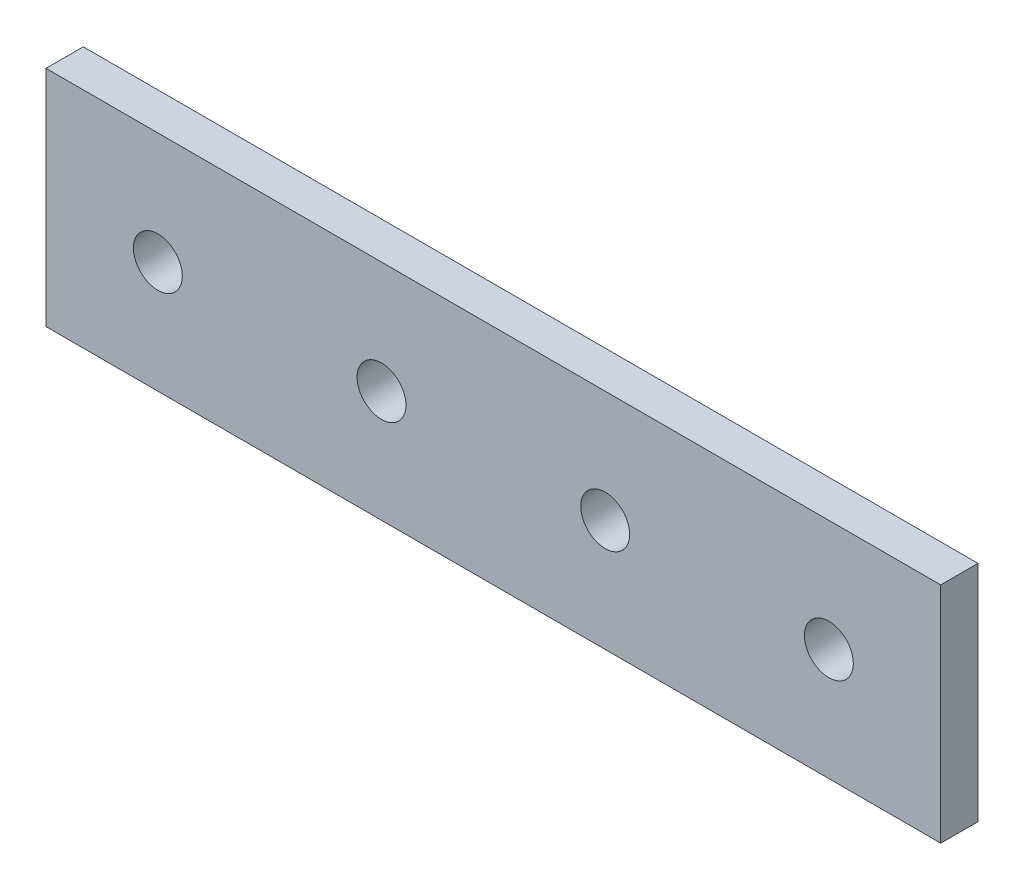
ISO-10303-21;
HEADER;
FILE_DESCRIPTION(('STEP AP214'),'2;1');
FILE_NAME('part.step','',(''),(''),'','','');
FILE_SCHEMA(('AUTOMOTIVE_DESIGN { 1 0 10303 214 1 1 1 1 }'));
ENDSEC;
DATA;
#1=APPLICATION_CONTEXT('core data for automotive mechanical design processes');
#2=APPLICATION_PROTOCOL_DEFINITION('international standard','automotive_design',2000,#1);
#3=PRODUCT_CONTEXT('',#1,'mechanical');
#4=PRODUCT('Part','Part','',(#3));
#5=PRODUCT_RELATED_PRODUCT_CATEGORY('part','',(#4));
#6=PRODUCT_DEFINITION_FORMATION('','',#4);
#7=PRODUCT_DEFINITION_CONTEXT('part definition',#1,'design');
#8=PRODUCT_DEFINITION('design','',#6,#7);
#9=PRODUCT_DEFINITION_SHAPE('','',#8);
#10=(LENGTH_UNIT() NAMED_UNIT(*) SI_UNIT(.MILLI.,.METRE.));
#11=(NAMED_UNIT(*) PLANE_ANGLE_UNIT() SI_UNIT($,.RADIAN.));
#12=(NAMED_UNIT(*) SI_UNIT($,.STERADIAN.) SOLID_ANGLE_UNIT());
#13=UNCERTAINTY_MEASURE_WITH_UNIT(LENGTH_MEASURE(1.E-05),#10,'distance_accuracy_value','');
#14=(GEOMETRIC_REPRESENTATION_CONTEXT(3) GLOBAL_UNCERTAINTY_ASSIGNED_CONTEXT((#13)) GLOBAL_UNIT_ASSIGNED_CONTEXT((#10,
#11,#12)) REPRESENTATION_CONTEXT('',''));
#15=CARTESIAN_POINT('',(0.,0.,0.));
#16=DIRECTION('',(0.,0.,1.));
#17=DIRECTION('',(1.,0.,0.));
#18=AXIS2_PLACEMENT_3D('',#15,#16,#17);
#19=CARTESIAN_POINT('',(0.,0.,3.175));
#20=DIRECTION('',(0.,0.,-1.));
#21=DIRECTION('',(-1.,0.,0.));
#22=AXIS2_PLACEMENT_3D('',#19,#20,#21);
#23=PLANE('',#22);
#24=CARTESIAN_POINT('',(95.25,19.05,3.175));
#25=DIRECTION('',(0.,0.,1.));
#26=DIRECTION('',(1.,0.,0.));
#27=AXIS2_PLACEMENT_3D('',#24,#25,#26);
#28=CIRCLE('',#27,4.1656);
#29=CARTESIAN_POINT('',(99.4156,19.05,3.175));
#30=VERTEX_POINT('',#29);
#31=EDGE_CURVE('E119',#30,#30,#28,.T.);
#32=ORIENTED_EDGE('',*,*,#31,.F.);
#33=EDGE_LOOP('',(#32));
#34=FACE_BOUND('',#33,.T.);
#35=CARTESIAN_POINT('',(19.05,19.05,3.175));
#36=DIRECTION('',(0.,0.,1.));
#37=DIRECTION('',(1.,0.,0.));
#38=AXIS2_PLACEMENT_3D('',#35,#36,#37);
#39=CIRCLE('',#38,4.1656);
#40=CARTESIAN_POINT('',(23.2156,19.05,3.175));
#41=VERTEX_POINT('',#40);
#42=EDGE_CURVE('E98',#41,#41,#39,.T.);
#43=ORIENTED_EDGE('',*,*,#42,.F.);
#44=EDGE_LOOP('',(#43));
#45=FACE_BOUND('',#44,.T.);
#46=DIRECTION('',(1.,0.,0.));
#47=VECTOR('',#46,1.);
#48=CARTESIAN_POINT('',(152.4,0.,3.175));
#49=LINE('',#48,#47);
#50=CARTESIAN_POINT('',(0.,0.,3.175));
#51=VERTEX_POINT('',#50);
#52=CARTESIAN_POINT('',(152.4,0.,3.175));
#53=VERTEX_POINT('',#52);
#54=EDGE_CURVE('E83',#51,#53,#49,.T.);
#55=ORIENTED_EDGE('',*,*,#54,.T.);
#56=DIRECTION('',(0.,1.,0.));
#57=VECTOR('',#56,1.);
#58=CARTESIAN_POINT('',(152.4,38.1,3.175));
#59=LINE('',#58,#57);
#60=CARTESIAN_POINT('',(152.4,38.1,3.175));
#61=VERTEX_POINT('',#60);
#62=EDGE_CURVE('E78',#53,#61,#59,.T.);
#63=ORIENTED_EDGE('',*,*,#62,.T.);
#64=DIRECTION('',(-1.,0.,0.));
#65=VECTOR('',#64,1.);
#66=CARTESIAN_POINT('',(152.4,38.1,3.175));
#67=LINE('',#66,#65);
#68=CARTESIAN_POINT('',(0.,38.1,3.175));
#69=VERTEX_POINT('',#68);
#70=EDGE_CURVE('E81',#61,#69,#67,.T.);
#71=ORIENTED_EDGE('',*,*,#70,.T.);
#72=DIRECTION('',(0.,-1.,0.));
#73=VECTOR('',#72,1.);
#74=CARTESIAN_POINT('',(0.,0.,3.175));
#75=LINE('',#74,#73);
#76=EDGE_CURVE('E48',#69,#51,#75,.T.);
#77=ORIENTED_EDGE('',*,*,#76,.T.);
#78=EDGE_LOOP('',(#55,#63,#71,#77));
#79=FACE_BOUND('',#78,.T.);
#80=CARTESIAN_POINT('',(57.15,19.05,3.175));
#81=DIRECTION('',(0.,0.,1.));
#82=DIRECTION('',(1.,0.,0.));
#83=AXIS2_PLACEMENT_3D('',#80,#81,#82);
#84=CIRCLE('',#83,4.1656);
#85=CARTESIAN_POINT('',(61.3156,19.05,3.175));
#86=VERTEX_POINT('',#85);
#87=EDGE_CURVE('E113',#86,#86,#84,.T.);
#88=ORIENTED_EDGE('',*,*,#87,.F.);
#89=EDGE_LOOP('',(#88));
#90=FACE_BOUND('',#89,.T.);
#91=CARTESIAN_POINT('',(133.35,19.05,3.175));
#92=DIRECTION('',(0.,0.,1.));
#93=DIRECTION('',(1.,0.,0.));
#94=AXIS2_PLACEMENT_3D('',#91,#92,#93);
#95=CIRCLE('',#94,4.1656);
#96=CARTESIAN_POINT('',(137.5156,19.05,3.175));
#97=VERTEX_POINT('',#96);
#98=EDGE_CURVE('E125',#97,#97,#95,.T.);
#99=ORIENTED_EDGE('',*,*,#98,.F.);
#100=EDGE_LOOP('',(#99));
#101=FACE_BOUND('',#100,.T.);
#102=ADVANCED_FACE('F31',(#34,#45,#79,#90,#101),#23,.F.);
#103=CARTESIAN_POINT('',(0.,0.,-3.175));
#104=DIRECTION('',(0.,0.,-1.));
#105=DIRECTION('',(-1.,0.,0.));
#106=AXIS2_PLACEMENT_3D('',#103,#104,#105);
#107=PLANE('',#106);
#108=CARTESIAN_POINT('',(95.25,19.05,-3.175));
#109=DIRECTION('',(0.,0.,1.));
#110=DIRECTION('',(1.,0.,0.));
#111=AXIS2_PLACEMENT_3D('',#108,#109,#110);
#112=CIRCLE('',#111,4.1656);
#113=CARTESIAN_POINT('',(99.4156,19.05,-3.175));
#114=VERTEX_POINT('',#113);
#115=EDGE_CURVE('E122',#114,#114,#112,.T.);
#116=ORIENTED_EDGE('',*,*,#115,.T.);
#117=EDGE_LOOP('',(#116));
#118=FACE_BOUND('',#117,.T.);
#119=CARTESIAN_POINT('',(19.05,19.05,-3.175));
#120=DIRECTION('',(0.,0.,1.));
#121=DIRECTION('',(1.,0.,0.));
#122=AXIS2_PLACEMENT_3D('',#119,#120,#121);
#123=CIRCLE('',#122,4.1656);
#124=CARTESIAN_POINT('',(23.2156,19.05,-3.175));
#125=VERTEX_POINT('',#124);
#126=EDGE_CURVE('E110',#125,#125,#123,.T.);
#127=ORIENTED_EDGE('',*,*,#126,.T.);
#128=EDGE_LOOP('',(#127));
#129=FACE_BOUND('',#128,.T.);
#130=DIRECTION('',(1.,0.,0.));
#131=VECTOR('',#130,1.);
#132=CARTESIAN_POINT('',(152.4,0.,-3.175));
#133=LINE('',#132,#131);
#134=CARTESIAN_POINT('',(0.,0.,-3.175));
#135=VERTEX_POINT('',#134);
#136=CARTESIAN_POINT('',(152.4,0.,-3.175));
#137=VERTEX_POINT('',#136);
#138=EDGE_CURVE('E95',#135,#137,#133,.T.);
#139=ORIENTED_EDGE('',*,*,#138,.F.);
#140=DIRECTION('',(0.,-1.,0.));
#141=VECTOR('',#140,1.);
#142=CARTESIAN_POINT('',(0.,0.,-3.175));
#143=LINE('',#142,#141);
#144=CARTESIAN_POINT('',(0.,38.1,-3.175));
#145=VERTEX_POINT('',#144);
#146=EDGE_CURVE('E71',#145,#135,#143,.T.);
#147=ORIENTED_EDGE('',*,*,#146,.F.);
#148=DIRECTION('',(-1.,0.,0.));
#149=VECTOR('',#148,1.);
#150=CARTESIAN_POINT('',(152.4,38.1,-3.175));
#151=LINE('',#150,#149);
#152=CARTESIAN_POINT('',(152.4,38.1,-3.175));
#153=VERTEX_POINT('',#152);
#154=EDGE_CURVE('E65',#153,#145,#151,.T.);
#155=ORIENTED_EDGE('',*,*,#154,.F.);
#156=DIRECTION('',(0.,1.,0.));
#157=VECTOR('',#156,1.);
#158=CARTESIAN_POINT('',(152.4,38.1,-3.175));
#159=LINE('',#158,#157);
#160=EDGE_CURVE('E87',#137,#153,#159,.T.);
#161=ORIENTED_EDGE('',*,*,#160,.F.);
#162=EDGE_LOOP('',(#139,#147,#155,#161));
#163=FACE_BOUND('',#162,.T.);
#164=CARTESIAN_POINT('',(57.15,19.05,-3.175));
#165=DIRECTION('',(0.,0.,1.));
#166=DIRECTION('',(1.,0.,0.));
#167=AXIS2_PLACEMENT_3D('',#164,#165,#166);
#168=CIRCLE('',#167,4.1656);
#169=CARTESIAN_POINT('',(61.3156,19.05,-3.175));
#170=VERTEX_POINT('',#169);
#171=EDGE_CURVE('E116',#170,#170,#168,.T.);
#172=ORIENTED_EDGE('',*,*,#171,.T.);
#173=EDGE_LOOP('',(#172));
#174=FACE_BOUND('',#173,.T.);
#175=CARTESIAN_POINT('',(133.35,19.05,-3.175));
#176=DIRECTION('',(0.,0.,1.));
#177=DIRECTION('',(1.,0.,0.));
#178=AXIS2_PLACEMENT_3D('',#175,#176,#177);
#179=CIRCLE('',#178,4.1656);
#180=CARTESIAN_POINT('',(137.5156,19.05,-3.175));
#181=VERTEX_POINT('',#180);
#182=EDGE_CURVE('E128',#181,#181,#179,.T.);
#183=ORIENTED_EDGE('',*,*,#182,.T.);
#184=EDGE_LOOP('',(#183));
#185=FACE_BOUND('',#184,.T.);
#186=ADVANCED_FACE('F106',(#118,#129,#163,#174,#185),#107,.T.);
#187=CARTESIAN_POINT('',(152.4,0.,3.175));
#188=DIRECTION('',(0.,1.,0.));
#189=DIRECTION('',(-1.,0.,0.));
#190=AXIS2_PLACEMENT_3D('',#187,#188,#189);
#191=PLANE('',#190);
#192=ORIENTED_EDGE('',*,*,#138,.T.);
#193=DIRECTION('',(0.,0.,-1.));
#194=VECTOR('',#193,1.);
#195=CARTESIAN_POINT('',(152.4,0.,3.175));
#196=LINE('',#195,#194);
#197=EDGE_CURVE('E11',#53,#137,#196,.T.);
#198=ORIENTED_EDGE('',*,*,#197,.F.);
#199=ORIENTED_EDGE('',*,*,#54,.F.);
#200=DIRECTION('',(0.,0.,-1.));
#201=VECTOR('',#200,1.);
#202=CARTESIAN_POINT('',(0.,0.,3.175));
#203=LINE('',#202,#201);
#204=EDGE_CURVE('E91',#51,#135,#203,.T.);
#205=ORIENTED_EDGE('',*,*,#204,.T.);
#206=EDGE_LOOP('',(#192,#198,#199,#205));
#207=FACE_BOUND('',#206,.T.);
#208=ADVANCED_FACE('F33',(#207),#191,.F.);
#209=CARTESIAN_POINT('',(152.4,38.1,3.175));
#210=DIRECTION('',(-1.,0.,0.));
#211=DIRECTION('',(0.,0.,1.));
#212=AXIS2_PLACEMENT_3D('',#209,#210,#211);
#213=PLANE('',#212);
#214=ORIENTED_EDGE('',*,*,#160,.T.);
#215=DIRECTION('',(0.,0.,-1.));
#216=VECTOR('',#215,1.);
#217=CARTESIAN_POINT('',(152.4,38.1,3.175));
#218=LINE('',#217,#216);
#219=EDGE_CURVE('E40',#61,#153,#218,.T.);
#220=ORIENTED_EDGE('',*,*,#219,.F.);
#221=ORIENTED_EDGE('',*,*,#62,.F.);
#222=ORIENTED_EDGE('',*,*,#197,.T.);
#223=EDGE_LOOP('',(#214,#220,#221,#222));
#224=FACE_BOUND('',#223,.T.);
#225=ADVANCED_FACE('F86',(#224),#213,.F.);
#226=CARTESIAN_POINT('',(152.4,38.1,3.175));
#227=DIRECTION('',(0.,-1.,0.));
#228=DIRECTION('',(1.,0.,0.));
#229=AXIS2_PLACEMENT_3D('',#226,#227,#228);
#230=PLANE('',#229);
#231=ORIENTED_EDGE('',*,*,#154,.T.);
#232=DIRECTION('',(0.,0.,-1.));
#233=VECTOR('',#232,1.);
#234=CARTESIAN_POINT('',(0.,38.1,3.175));
#235=LINE('',#234,#233);
#236=EDGE_CURVE('E88',#69,#145,#235,.T.);
#237=ORIENTED_EDGE('',*,*,#236,.F.);
#238=ORIENTED_EDGE('',*,*,#70,.F.);
#239=ORIENTED_EDGE('',*,*,#219,.T.);
#240=EDGE_LOOP('',(#231,#237,#238,#239));
#241=FACE_BOUND('',#240,.T.);
#242=ADVANCED_FACE('F89',(#241),#230,.F.);
#243=CARTESIAN_POINT('',(0.,0.,3.175));
#244=DIRECTION('',(1.,0.,0.));
#245=DIRECTION('',(0.,0.,-1.));
#246=AXIS2_PLACEMENT_3D('',#243,#244,#245);
#247=PLANE('',#246);
#248=ORIENTED_EDGE('',*,*,#146,.T.);
#249=ORIENTED_EDGE('',*,*,#204,.F.);
#250=ORIENTED_EDGE('',*,*,#76,.F.);
#251=ORIENTED_EDGE('',*,*,#236,.T.);
#252=EDGE_LOOP('',(#248,#249,#250,#251));
#253=FACE_BOUND('',#252,.T.);
#254=ADVANCED_FACE('F103',(#253),#247,.F.);
#255=CARTESIAN_POINT('',(19.05,19.05,3.175));
#256=DIRECTION('',(0.,0.,-1.));
#257=DIRECTION('',(-1.,0.,0.));
#258=AXIS2_PLACEMENT_3D('',#255,#256,#257);
#259=CYLINDRICAL_SURFACE('',#258,4.1656);
#260=ORIENTED_EDGE('',*,*,#42,.T.);
#261=EDGE_LOOP('',(#260));
#262=FACE_BOUND('',#261,.T.);
#263=ORIENTED_EDGE('',*,*,#126,.F.);
#264=EDGE_LOOP('',(#263));
#265=FACE_BOUND('',#264,.T.);
#266=ADVANCED_FACE('F148',(#262,#265),#259,.F.);
#267=CARTESIAN_POINT('',(57.15,19.05,3.175));
#268=DIRECTION('',(0.,0.,-1.));
#269=DIRECTION('',(-1.,0.,0.));
#270=AXIS2_PLACEMENT_3D('',#267,#268,#269);
#271=CYLINDRICAL_SURFACE('',#270,4.1656);
#272=ORIENTED_EDGE('',*,*,#87,.T.);
#273=EDGE_LOOP('',(#272));
#274=FACE_BOUND('',#273,.T.);
#275=ORIENTED_EDGE('',*,*,#171,.F.);
#276=EDGE_LOOP('',(#275));
#277=FACE_BOUND('',#276,.T.);
#278=ADVANCED_FACE('F194',(#274,#277),#271,.F.);
#279=CARTESIAN_POINT('',(95.25,19.05,3.175));
#280=DIRECTION('',(0.,0.,-1.));
#281=DIRECTION('',(-1.,0.,0.));
#282=AXIS2_PLACEMENT_3D('',#279,#280,#281);
#283=CYLINDRICAL_SURFACE('',#282,4.1656);
#284=ORIENTED_EDGE('',*,*,#31,.T.);
#285=EDGE_LOOP('',(#284));
#286=FACE_BOUND('',#285,.T.);
#287=ORIENTED_EDGE('',*,*,#115,.F.);
#288=EDGE_LOOP('',(#287));
#289=FACE_BOUND('',#288,.T.);
#290=ADVANCED_FACE('F202',(#286,#289),#283,.F.);
#291=CARTESIAN_POINT('',(133.35,19.05,3.175));
#292=DIRECTION('',(0.,0.,-1.));
#293=DIRECTION('',(-1.,0.,0.));
#294=AXIS2_PLACEMENT_3D('',#291,#292,#293);
#295=CYLINDRICAL_SURFACE('',#294,4.1656);
#296=ORIENTED_EDGE('',*,*,#98,.T.);
#297=EDGE_LOOP('',(#296));
#298=FACE_BOUND('',#297,.T.);
#299=ORIENTED_EDGE('',*,*,#182,.F.);
#300=EDGE_LOOP('',(#299));
#301=FACE_BOUND('',#300,.T.);
#302=ADVANCED_FACE('F134',(#298,#301),#295,.F.);
#303=CLOSED_SHELL('',(#102,#186,#208,#225,#242,#254,#266,#278,#290,#302));
#304=MANIFOLD_SOLID_BREP('B2',#303);
#305=ADVANCED_BREP_SHAPE_REPRESENTATION('',(#18,#304),#14);
#306=SHAPE_DEFINITION_REPRESENTATION(#9,#305);
ENDSEC;
END-ISO-10303-21;
